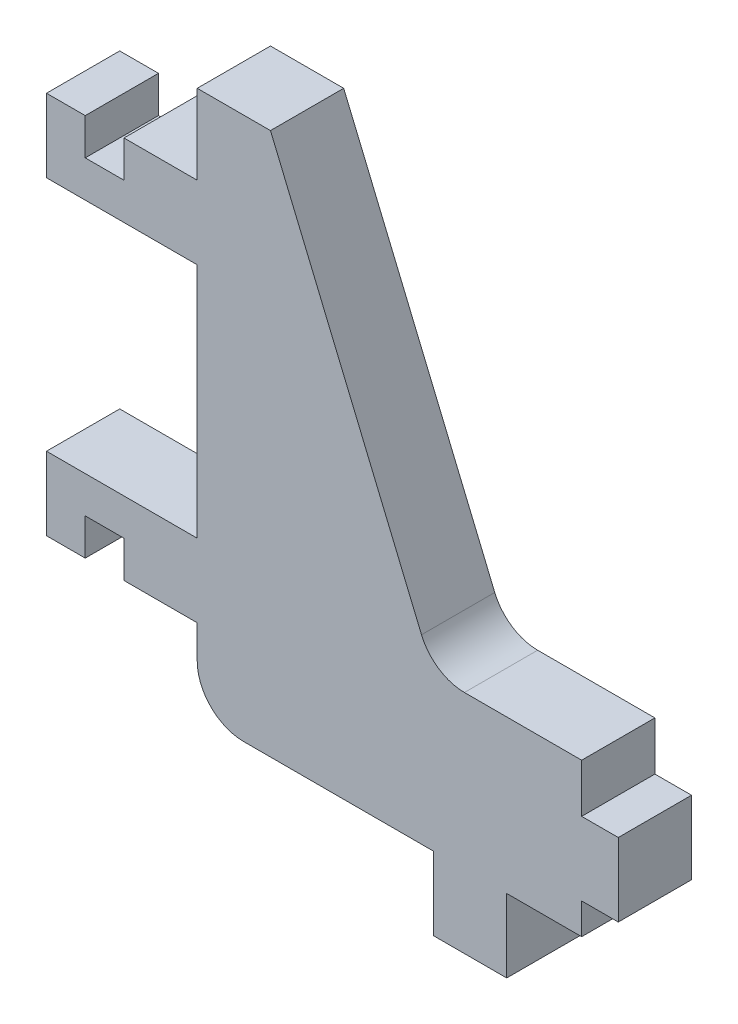
ISO-10303-21;
HEADER;
FILE_DESCRIPTION(('STEP AP214'),'2;1');
FILE_NAME('part.step','',(''),(''),'','','');
FILE_SCHEMA(('AUTOMOTIVE_DESIGN { 1 0 10303 214 1 1 1 1 }'));
ENDSEC;
DATA;
#1=APPLICATION_CONTEXT('core data for automotive mechanical design processes');
#2=APPLICATION_PROTOCOL_DEFINITION('international standard','automotive_design',2000,#1);
#3=PRODUCT_CONTEXT('',#1,'mechanical');
#4=PRODUCT('Part','Part','',(#3));
#5=PRODUCT_RELATED_PRODUCT_CATEGORY('part','',(#4));
#6=PRODUCT_DEFINITION_FORMATION('','',#4);
#7=PRODUCT_DEFINITION_CONTEXT('part definition',#1,'design');
#8=PRODUCT_DEFINITION('design','',#6,#7);
#9=PRODUCT_DEFINITION_SHAPE('','',#8);
#10=(LENGTH_UNIT() NAMED_UNIT(*) SI_UNIT(.MILLI.,.METRE.));
#11=(NAMED_UNIT(*) PLANE_ANGLE_UNIT() SI_UNIT($,.RADIAN.));
#12=(NAMED_UNIT(*) SI_UNIT($,.STERADIAN.) SOLID_ANGLE_UNIT());
#13=UNCERTAINTY_MEASURE_WITH_UNIT(LENGTH_MEASURE(1.E-05),#10,'distance_accuracy_value','');
#14=(GEOMETRIC_REPRESENTATION_CONTEXT(3) GLOBAL_UNCERTAINTY_ASSIGNED_CONTEXT((#13)) GLOBAL_UNIT_ASSIGNED_CONTEXT((#10,
#11,#12)) REPRESENTATION_CONTEXT('',''));
#15=CARTESIAN_POINT('',(0.,0.,0.));
#16=DIRECTION('',(0.,0.,1.));
#17=DIRECTION('',(1.,0.,0.));
#18=AXIS2_PLACEMENT_3D('',#15,#16,#17);
#19=CARTESIAN_POINT('',(-12.35,0.,6.));
#20=DIRECTION('',(1.,0.,0.));
#21=DIRECTION('',(0.,1.,0.));
#22=AXIS2_PLACEMENT_3D('',#19,#20,#21);
#23=PLANE('',#22);
#24=DIRECTION('',(0.,-1.,0.));
#25=VECTOR('',#24,1.);
#26=CARTESIAN_POINT('',(-12.35,0.,0.));
#27=LINE('',#26,#25);
#28=CARTESIAN_POINT('',(-12.35,37.925,0.));
#29=VERTEX_POINT('',#28);
#30=CARTESIAN_POINT('',(-12.35,31.925,0.));
#31=VERTEX_POINT('',#30);
#32=EDGE_CURVE('E283',#29,#31,#27,.T.);
#33=ORIENTED_EDGE('',*,*,#32,.T.);
#34=DIRECTION('',(0.,0.,-1.));
#35=VECTOR('',#34,1.);
#36=CARTESIAN_POINT('',(-12.35,31.925,6.));
#37=LINE('',#36,#35);
#38=CARTESIAN_POINT('',(-12.35,31.925,6.));
#39=VERTEX_POINT('',#38);
#40=EDGE_CURVE('E262',#39,#31,#37,.T.);
#41=ORIENTED_EDGE('',*,*,#40,.F.);
#42=DIRECTION('',(0.,-1.,0.));
#43=VECTOR('',#42,1.);
#44=CARTESIAN_POINT('',(-12.35,0.,6.));
#45=LINE('',#44,#43);
#46=CARTESIAN_POINT('',(-12.35,37.925,6.));
#47=VERTEX_POINT('',#46);
#48=EDGE_CURVE('E269',#47,#39,#45,.T.);
#49=ORIENTED_EDGE('',*,*,#48,.F.);
#50=DIRECTION('',(0.,0.,-1.));
#51=VECTOR('',#50,1.);
#52=CARTESIAN_POINT('',(-12.35,37.925,6.));
#53=LINE('',#52,#51);
#54=EDGE_CURVE('E361',#47,#29,#53,.T.);
#55=ORIENTED_EDGE('',*,*,#54,.T.);
#56=EDGE_LOOP('',(#33,#41,#49,#55));
#57=FACE_BOUND('',#56,.T.);
#58=ADVANCED_FACE('F47',(#57),#23,.F.);
#59=CARTESIAN_POINT('',(0.,31.925,6.));
#60=DIRECTION('',(0.,1.,0.));
#61=DIRECTION('',(0.,0.,1.));
#62=AXIS2_PLACEMENT_3D('',#59,#60,#61);
#63=PLANE('',#62);
#64=DIRECTION('',(1.,0.,0.));
#65=VECTOR('',#64,1.);
#66=CARTESIAN_POINT('',(0.,31.925,0.));
#67=LINE('',#66,#65);
#68=CARTESIAN_POINT('',(0.,31.925,0.));
#69=VERTEX_POINT('',#68);
#70=EDGE_CURVE('E364',#31,#69,#67,.T.);
#71=ORIENTED_EDGE('',*,*,#70,.T.);
#72=DIRECTION('',(0.,0.,-1.));
#73=VECTOR('',#72,1.);
#74=CARTESIAN_POINT('',(0.,31.925,6.));
#75=LINE('',#74,#73);
#76=CARTESIAN_POINT('',(0.,31.925,6.));
#77=VERTEX_POINT('',#76);
#78=EDGE_CURVE('E264',#77,#69,#75,.T.);
#79=ORIENTED_EDGE('',*,*,#78,.F.);
#80=DIRECTION('',(1.,0.,0.));
#81=VECTOR('',#80,1.);
#82=CARTESIAN_POINT('',(0.,31.925,6.));
#83=LINE('',#82,#81);
#84=EDGE_CURVE('E257',#39,#77,#83,.T.);
#85=ORIENTED_EDGE('',*,*,#84,.F.);
#86=ORIENTED_EDGE('',*,*,#40,.T.);
#87=EDGE_LOOP('',(#71,#79,#85,#86));
#88=FACE_BOUND('',#87,.T.);
#89=ADVANCED_FACE('F260',(#88),#63,.F.);
#90=CARTESIAN_POINT('',(0.,0.,6.));
#91=DIRECTION('',(-1.,0.,0.));
#92=DIRECTION('',(0.,0.,1.));
#93=AXIS2_PLACEMENT_3D('',#90,#91,#92);
#94=PLANE('',#93);
#95=DIRECTION('',(0.,1.,0.));
#96=VECTOR('',#95,1.);
#97=CARTESIAN_POINT('',(0.,0.,0.));
#98=LINE('',#97,#96);
#99=CARTESIAN_POINT('',(0.,12.525,0.));
#100=VERTEX_POINT('',#99);
#101=EDGE_CURVE('E367',#100,#69,#98,.T.);
#102=ORIENTED_EDGE('',*,*,#101,.F.);
#103=DIRECTION('',(0.,0.,-1.));
#104=VECTOR('',#103,1.);
#105=CARTESIAN_POINT('',(0.,12.525,6.));
#106=LINE('',#105,#104);
#107=CARTESIAN_POINT('',(0.,12.525,6.));
#108=VERTEX_POINT('',#107);
#109=EDGE_CURVE('E292',#108,#100,#106,.T.);
#110=ORIENTED_EDGE('',*,*,#109,.F.);
#111=DIRECTION('',(0.,1.,0.));
#112=VECTOR('',#111,1.);
#113=CARTESIAN_POINT('',(0.,0.,6.));
#114=LINE('',#113,#112);
#115=EDGE_CURVE('E268',#108,#77,#114,.T.);
#116=ORIENTED_EDGE('',*,*,#115,.T.);
#117=ORIENTED_EDGE('',*,*,#78,.T.);
#118=EDGE_LOOP('',(#102,#110,#116,#117));
#119=FACE_BOUND('',#118,.T.);
#120=ADVANCED_FACE('F543',(#119),#94,.T.);
#121=CARTESIAN_POINT('',(0.,12.525,6.));
#122=DIRECTION('',(0.,1.,0.));
#123=DIRECTION('',(0.,0.,1.));
#124=AXIS2_PLACEMENT_3D('',#121,#122,#123);
#125=PLANE('',#124);
#126=DIRECTION('',(1.,0.,0.));
#127=VECTOR('',#126,1.);
#128=CARTESIAN_POINT('',(0.,12.525,0.));
#129=LINE('',#128,#127);
#130=CARTESIAN_POINT('',(-12.35,12.525,0.));
#131=VERTEX_POINT('',#130);
#132=EDGE_CURVE('E371',#131,#100,#129,.T.);
#133=ORIENTED_EDGE('',*,*,#132,.F.);
#134=DIRECTION('',(0.,0.,-1.));
#135=VECTOR('',#134,1.);
#136=CARTESIAN_POINT('',(-12.35,12.525,6.));
#137=LINE('',#136,#135);
#138=CARTESIAN_POINT('',(-12.35,12.525,6.));
#139=VERTEX_POINT('',#138);
#140=EDGE_CURVE('E532',#139,#131,#137,.T.);
#141=ORIENTED_EDGE('',*,*,#140,.F.);
#142=DIRECTION('',(1.,0.,0.));
#143=VECTOR('',#142,1.);
#144=CARTESIAN_POINT('',(0.,12.525,6.));
#145=LINE('',#144,#143);
#146=EDGE_CURVE('E541',#139,#108,#145,.T.);
#147=ORIENTED_EDGE('',*,*,#146,.T.);
#148=ORIENTED_EDGE('',*,*,#109,.T.);
#149=EDGE_LOOP('',(#133,#141,#147,#148));
#150=FACE_BOUND('',#149,.T.);
#151=ADVANCED_FACE('F539',(#150),#125,.T.);
#152=CARTESIAN_POINT('',(-12.35,0.,6.));
#153=DIRECTION('',(-1.,0.,0.));
#154=DIRECTION('',(0.,-1.,0.));
#155=AXIS2_PLACEMENT_3D('',#152,#153,#154);
#156=PLANE('',#155);
#157=DIRECTION('',(0.,1.,0.));
#158=VECTOR('',#157,1.);
#159=CARTESIAN_POINT('',(-12.35,0.,0.));
#160=LINE('',#159,#158);
#161=CARTESIAN_POINT('',(-12.35,6.525,0.));
#162=VERTEX_POINT('',#161);
#163=EDGE_CURVE('E377',#162,#131,#160,.T.);
#164=ORIENTED_EDGE('',*,*,#163,.F.);
#165=DIRECTION('',(0.,0.,-1.));
#166=VECTOR('',#165,1.);
#167=CARTESIAN_POINT('',(-12.35,6.525,6.));
#168=LINE('',#167,#166);
#169=CARTESIAN_POINT('',(-12.35,6.525,6.));
#170=VERTEX_POINT('',#169);
#171=EDGE_CURVE('E529',#170,#162,#168,.T.);
#172=ORIENTED_EDGE('',*,*,#171,.F.);
#173=DIRECTION('',(0.,1.,0.));
#174=VECTOR('',#173,1.);
#175=CARTESIAN_POINT('',(-12.35,0.,6.));
#176=LINE('',#175,#174);
#177=EDGE_CURVE('E550',#170,#139,#176,.T.);
#178=ORIENTED_EDGE('',*,*,#177,.T.);
#179=ORIENTED_EDGE('',*,*,#140,.T.);
#180=EDGE_LOOP('',(#164,#172,#178,#179));
#181=FACE_BOUND('',#180,.T.);
#182=ADVANCED_FACE('F547',(#181),#156,.T.);
#183=CARTESIAN_POINT('',(0.,6.52499999999999,6.));
#184=DIRECTION('',(0.,-1.,0.));
#185=DIRECTION('',(1.,0.,0.));
#186=AXIS2_PLACEMENT_3D('',#183,#184,#185);
#187=PLANE('',#186);
#188=DIRECTION('',(-1.,0.,0.));
#189=VECTOR('',#188,1.);
#190=CARTESIAN_POINT('',(0.,6.52499999999999,0.));
#191=LINE('',#190,#189);
#192=CARTESIAN_POINT('',(-9.175,6.525,0.));
#193=VERTEX_POINT('',#192);
#194=EDGE_CURVE('E381',#193,#162,#191,.T.);
#195=ORIENTED_EDGE('',*,*,#194,.F.);
#196=DIRECTION('',(0.,0.,-1.));
#197=VECTOR('',#196,1.);
#198=CARTESIAN_POINT('',(-9.175,6.525,6.));
#199=LINE('',#198,#197);
#200=CARTESIAN_POINT('',(-9.175,6.525,6.));
#201=VERTEX_POINT('',#200);
#202=EDGE_CURVE('E526',#201,#193,#199,.T.);
#203=ORIENTED_EDGE('',*,*,#202,.F.);
#204=DIRECTION('',(-1.,0.,0.));
#205=VECTOR('',#204,1.);
#206=CARTESIAN_POINT('',(0.,6.52499999999999,6.));
#207=LINE('',#206,#205);
#208=EDGE_CURVE('E557',#201,#170,#207,.T.);
#209=ORIENTED_EDGE('',*,*,#208,.T.);
#210=ORIENTED_EDGE('',*,*,#171,.T.);
#211=EDGE_LOOP('',(#195,#203,#209,#210));
#212=FACE_BOUND('',#211,.T.);
#213=ADVANCED_FACE('F805',(#212),#187,.T.);
#214=CARTESIAN_POINT('',(-9.175,0.,6.));
#215=DIRECTION('',(1.,0.,0.));
#216=DIRECTION('',(0.,0.,-1.));
#217=AXIS2_PLACEMENT_3D('',#214,#215,#216);
#218=PLANE('',#217);
#219=DIRECTION('',(0.,-1.,0.));
#220=VECTOR('',#219,1.);
#221=CARTESIAN_POINT('',(-9.175,0.,0.));
#222=LINE('',#221,#220);
#223=CARTESIAN_POINT('',(-9.175,9.525,0.));
#224=VERTEX_POINT('',#223);
#225=EDGE_CURVE('E385',#224,#193,#222,.T.);
#226=ORIENTED_EDGE('',*,*,#225,.F.);
#227=DIRECTION('',(0.,0.,-1.));
#228=VECTOR('',#227,1.);
#229=CARTESIAN_POINT('',(-9.175,9.525,6.));
#230=LINE('',#229,#228);
#231=CARTESIAN_POINT('',(-9.175,9.525,6.));
#232=VERTEX_POINT('',#231);
#233=EDGE_CURVE('E523',#232,#224,#230,.T.);
#234=ORIENTED_EDGE('',*,*,#233,.F.);
#235=DIRECTION('',(0.,-1.,0.));
#236=VECTOR('',#235,1.);
#237=CARTESIAN_POINT('',(-9.175,0.,6.));
#238=LINE('',#237,#236);
#239=EDGE_CURVE('E564',#232,#201,#238,.T.);
#240=ORIENTED_EDGE('',*,*,#239,.T.);
#241=ORIENTED_EDGE('',*,*,#202,.T.);
#242=EDGE_LOOP('',(#226,#234,#240,#241));
#243=FACE_BOUND('',#242,.T.);
#244=ADVANCED_FACE('F795',(#243),#218,.T.);
#245=CARTESIAN_POINT('',(0.,9.525,6.));
#246=DIRECTION('',(0.,-1.,0.));
#247=DIRECTION('',(0.,0.,-1.));
#248=AXIS2_PLACEMENT_3D('',#245,#246,#247);
#249=PLANE('',#248);
#250=DIRECTION('',(-1.,0.,0.));
#251=VECTOR('',#250,1.);
#252=CARTESIAN_POINT('',(0.,9.525,0.));
#253=LINE('',#252,#251);
#254=CARTESIAN_POINT('',(-6.,9.525,0.));
#255=VERTEX_POINT('',#254);
#256=EDGE_CURVE('E389',#255,#224,#253,.T.);
#257=ORIENTED_EDGE('',*,*,#256,.F.);
#258=DIRECTION('',(0.,0.,-1.));
#259=VECTOR('',#258,1.);
#260=CARTESIAN_POINT('',(-6.,9.525,6.));
#261=LINE('',#260,#259);
#262=CARTESIAN_POINT('',(-6.,9.525,6.));
#263=VERTEX_POINT('',#262);
#264=EDGE_CURVE('E520',#263,#255,#261,.T.);
#265=ORIENTED_EDGE('',*,*,#264,.F.);
#266=DIRECTION('',(-1.,0.,0.));
#267=VECTOR('',#266,1.);
#268=CARTESIAN_POINT('',(0.,9.525,6.));
#269=LINE('',#268,#267);
#270=EDGE_CURVE('E568',#263,#232,#269,.T.);
#271=ORIENTED_EDGE('',*,*,#270,.T.);
#272=ORIENTED_EDGE('',*,*,#233,.T.);
#273=EDGE_LOOP('',(#257,#265,#271,#272));
#274=FACE_BOUND('',#273,.T.);
#275=ADVANCED_FACE('F785',(#274),#249,.T.);
#276=CARTESIAN_POINT('',(-6.,0.,6.));
#277=DIRECTION('',(-1.,0.,0.));
#278=DIRECTION('',(0.,0.,1.));
#279=AXIS2_PLACEMENT_3D('',#276,#277,#278);
#280=PLANE('',#279);
#281=DIRECTION('',(0.,1.,0.));
#282=VECTOR('',#281,1.);
#283=CARTESIAN_POINT('',(-6.,0.,0.));
#284=LINE('',#283,#282);
#285=CARTESIAN_POINT('',(-6.,6.525,0.));
#286=VERTEX_POINT('',#285);
#287=EDGE_CURVE('E393',#286,#255,#284,.T.);
#288=ORIENTED_EDGE('',*,*,#287,.F.);
#289=DIRECTION('',(0.,0.,-1.));
#290=VECTOR('',#289,1.);
#291=CARTESIAN_POINT('',(-6.,6.525,6.));
#292=LINE('',#291,#290);
#293=CARTESIAN_POINT('',(-6.,6.525,6.));
#294=VERTEX_POINT('',#293);
#295=EDGE_CURVE('E517',#294,#286,#292,.T.);
#296=ORIENTED_EDGE('',*,*,#295,.F.);
#297=DIRECTION('',(0.,1.,0.));
#298=VECTOR('',#297,1.);
#299=CARTESIAN_POINT('',(-6.,0.,6.));
#300=LINE('',#299,#298);
#301=EDGE_CURVE('E572',#294,#263,#300,.T.);
#302=ORIENTED_EDGE('',*,*,#301,.T.);
#303=ORIENTED_EDGE('',*,*,#264,.T.);
#304=EDGE_LOOP('',(#288,#296,#302,#303));
#305=FACE_BOUND('',#304,.T.);
#306=ADVANCED_FACE('F774',(#305),#280,.T.);
#307=CARTESIAN_POINT('',(0.,6.525,6.));
#308=DIRECTION('',(0.,-1.,0.));
#309=DIRECTION('',(1.,0.,0.));
#310=AXIS2_PLACEMENT_3D('',#307,#308,#309);
#311=PLANE('',#310);
#312=DIRECTION('',(-1.,0.,0.));
#313=VECTOR('',#312,1.);
#314=CARTESIAN_POINT('',(0.,6.525,0.));
#315=LINE('',#314,#313);
#316=CARTESIAN_POINT('',(0.,6.525,0.));
#317=VERTEX_POINT('',#316);
#318=EDGE_CURVE('E397',#317,#286,#315,.T.);
#319=ORIENTED_EDGE('',*,*,#318,.F.);
#320=DIRECTION('',(0.,0.,-1.));
#321=VECTOR('',#320,1.);
#322=CARTESIAN_POINT('',(0.,6.525,6.));
#323=LINE('',#322,#321);
#324=CARTESIAN_POINT('',(0.,6.525,6.));
#325=VERTEX_POINT('',#324);
#326=EDGE_CURVE('E513',#325,#317,#323,.T.);
#327=ORIENTED_EDGE('',*,*,#326,.F.);
#328=DIRECTION('',(-1.,0.,0.));
#329=VECTOR('',#328,1.);
#330=CARTESIAN_POINT('',(0.,6.525,6.));
#331=LINE('',#330,#329);
#332=EDGE_CURVE('E576',#325,#294,#331,.T.);
#333=ORIENTED_EDGE('',*,*,#332,.T.);
#334=ORIENTED_EDGE('',*,*,#295,.T.);
#335=EDGE_LOOP('',(#319,#327,#333,#334));
#336=FACE_BOUND('',#335,.T.);
#337=ADVANCED_FACE('F762',(#336),#311,.T.);
#338=CARTESIAN_POINT('',(0.,3.81,0.));
#339=VERTEX_POINT('',#338);
#340=EDGE_CURVE('E372',#339,#317,#98,.T.);
#341=ORIENTED_EDGE('',*,*,#340,.F.);
#342=DIRECTION('',(0.,0.,-1.));
#343=VECTOR('',#342,1.);
#344=CARTESIAN_POINT('',(0.,3.81,6.));
#345=LINE('',#344,#343);
#346=CARTESIAN_POINT('',(0.,3.81,6.));
#347=VERTEX_POINT('',#346);
#348=EDGE_CURVE('E298',#339,#347,#345,.F.);
#349=ORIENTED_EDGE('',*,*,#348,.T.);
#350=EDGE_CURVE('E560',#347,#325,#114,.T.);
#351=ORIENTED_EDGE('',*,*,#350,.T.);
#352=ORIENTED_EDGE('',*,*,#326,.T.);
#353=EDGE_LOOP('',(#341,#349,#351,#352));
#354=FACE_BOUND('',#353,.T.);
#355=ADVANCED_FACE('F660',(#354),#94,.T.);
#356=CARTESIAN_POINT('',(0.,0.,6.));
#357=DIRECTION('',(0.,1.,0.));
#358=DIRECTION('',(0.,0.,1.));
#359=AXIS2_PLACEMENT_3D('',#356,#357,#358);
#360=PLANE('',#359);
#361=DIRECTION('',(1.,0.,0.));
#362=VECTOR('',#361,1.);
#363=CARTESIAN_POINT('',(0.,0.,6.));
#364=LINE('',#363,#362);
#365=CARTESIAN_POINT('',(3.81,0.,6.));
#366=VERTEX_POINT('',#365);
#367=CARTESIAN_POINT('',(19.3548,0.,6.));
#368=VERTEX_POINT('',#367);
#369=EDGE_CURVE('E580',#366,#368,#364,.T.);
#370=ORIENTED_EDGE('',*,*,#369,.F.);
#371=DIRECTION('',(0.,0.,-1.));
#372=VECTOR('',#371,1.);
#373=CARTESIAN_POINT('',(3.81,0.,0.));
#374=LINE('',#373,#372);
#375=CARTESIAN_POINT('',(3.81,0.,0.));
#376=VERTEX_POINT('',#375);
#377=EDGE_CURVE('E285',#366,#376,#374,.T.);
#378=ORIENTED_EDGE('',*,*,#377,.T.);
#379=DIRECTION('',(1.,0.,0.));
#380=VECTOR('',#379,1.);
#381=CARTESIAN_POINT('',(0.,0.,0.));
#382=LINE('',#381,#380);
#383=CARTESIAN_POINT('',(19.3548,0.,0.));
#384=VERTEX_POINT('',#383);
#385=EDGE_CURVE('E401',#376,#384,#382,.T.);
#386=ORIENTED_EDGE('',*,*,#385,.T.);
#387=DIRECTION('',(0.,0.,-1.));
#388=VECTOR('',#387,1.);
#389=CARTESIAN_POINT('',(19.3548,0.,6.));
#390=LINE('',#389,#388);
#391=EDGE_CURVE('E509',#368,#384,#390,.T.);
#392=ORIENTED_EDGE('',*,*,#391,.F.);
#393=EDGE_LOOP('',(#370,#378,#386,#392));
#394=FACE_BOUND('',#393,.T.);
#395=ADVANCED_FACE('F654',(#394),#360,.F.);
#396=CARTESIAN_POINT('',(19.3548,0.,6.));
#397=DIRECTION('',(1.,0.,0.));
#398=DIRECTION('',(0.,0.,-1.));
#399=AXIS2_PLACEMENT_3D('',#396,#397,#398);
#400=PLANE('',#399);
#401=DIRECTION('',(0.,-1.,0.));
#402=VECTOR('',#401,1.);
#403=CARTESIAN_POINT('',(19.3548,0.,0.));
#404=LINE('',#403,#402);
#405=CARTESIAN_POINT('',(19.3548,-6.,0.));
#406=VERTEX_POINT('',#405);
#407=EDGE_CURVE('E404',#384,#406,#404,.T.);
#408=ORIENTED_EDGE('',*,*,#407,.T.);
#409=DIRECTION('',(0.,0.,-1.));
#410=VECTOR('',#409,1.);
#411=CARTESIAN_POINT('',(19.3548,-6.,6.));
#412=LINE('',#411,#410);
#413=CARTESIAN_POINT('',(19.3548,-6.,6.));
#414=VERTEX_POINT('',#413);
#415=EDGE_CURVE('E505',#414,#406,#412,.T.);
#416=ORIENTED_EDGE('',*,*,#415,.F.);
#417=DIRECTION('',(0.,-1.,0.));
#418=VECTOR('',#417,1.);
#419=CARTESIAN_POINT('',(19.3548,0.,6.));
#420=LINE('',#419,#418);
#421=EDGE_CURVE('E583',#368,#414,#420,.T.);
#422=ORIENTED_EDGE('',*,*,#421,.F.);
#423=ORIENTED_EDGE('',*,*,#391,.T.);
#424=EDGE_LOOP('',(#408,#416,#422,#423));
#425=FACE_BOUND('',#424,.T.);
#426=ADVANCED_FACE('F650',(#425),#400,.F.);
#427=CARTESIAN_POINT('',(0.,-6.,6.));
#428=DIRECTION('',(0.,1.,0.));
#429=DIRECTION('',(-1.,0.,0.));
#430=AXIS2_PLACEMENT_3D('',#427,#428,#429);
#431=PLANE('',#430);
#432=DIRECTION('',(1.,0.,0.));
#433=VECTOR('',#432,1.);
#434=CARTESIAN_POINT('',(0.,-6.,0.));
#435=LINE('',#434,#433);
#436=CARTESIAN_POINT('',(25.3548,-6.,0.));
#437=VERTEX_POINT('',#436);
#438=EDGE_CURVE('E407',#406,#437,#435,.T.);
#439=ORIENTED_EDGE('',*,*,#438,.T.);
#440=DIRECTION('',(0.,0.,-1.));
#441=VECTOR('',#440,1.);
#442=CARTESIAN_POINT('',(25.3548,-6.,6.));
#443=LINE('',#442,#441);
#444=CARTESIAN_POINT('',(25.3548,-6.,6.));
#445=VERTEX_POINT('',#444);
#446=EDGE_CURVE('E501',#445,#437,#443,.T.);
#447=ORIENTED_EDGE('',*,*,#446,.F.);
#448=DIRECTION('',(1.,0.,0.));
#449=VECTOR('',#448,1.);
#450=CARTESIAN_POINT('',(0.,-6.,6.));
#451=LINE('',#450,#449);
#452=EDGE_CURVE('E586',#414,#445,#451,.T.);
#453=ORIENTED_EDGE('',*,*,#452,.F.);
#454=ORIENTED_EDGE('',*,*,#415,.T.);
#455=EDGE_LOOP('',(#439,#447,#453,#454));
#456=FACE_BOUND('',#455,.T.);
#457=ADVANCED_FACE('F645',(#456),#431,.F.);
#458=CARTESIAN_POINT('',(25.3548,0.,6.));
#459=DIRECTION('',(-1.,0.,0.));
#460=DIRECTION('',(0.,0.,1.));
#461=AXIS2_PLACEMENT_3D('',#458,#459,#460);
#462=PLANE('',#461);
#463=DIRECTION('',(0.,1.,0.));
#464=VECTOR('',#463,1.);
#465=CARTESIAN_POINT('',(25.3548,0.,0.));
#466=LINE('',#465,#464);
#467=CARTESIAN_POINT('',(25.3548,0.,0.));
#468=VERTEX_POINT('',#467);
#469=EDGE_CURVE('E410',#437,#468,#466,.T.);
#470=ORIENTED_EDGE('',*,*,#469,.T.);
#471=DIRECTION('',(0.,0.,-1.));
#472=VECTOR('',#471,1.);
#473=CARTESIAN_POINT('',(25.3548,0.,6.));
#474=LINE('',#473,#472);
#475=CARTESIAN_POINT('',(25.3548,0.,6.));
#476=VERTEX_POINT('',#475);
#477=EDGE_CURVE('E497',#476,#468,#474,.T.);
#478=ORIENTED_EDGE('',*,*,#477,.F.);
#479=DIRECTION('',(0.,1.,0.));
#480=VECTOR('',#479,1.);
#481=CARTESIAN_POINT('',(25.3548,0.,6.));
#482=LINE('',#481,#480);
#483=EDGE_CURVE('E589',#445,#476,#482,.T.);
#484=ORIENTED_EDGE('',*,*,#483,.F.);
#485=ORIENTED_EDGE('',*,*,#446,.T.);
#486=EDGE_LOOP('',(#470,#478,#484,#485));
#487=FACE_BOUND('',#486,.T.);
#488=ADVANCED_FACE('F640',(#487),#462,.F.);
#489=CARTESIAN_POINT('',(0.,0.,6.));
#490=DIRECTION('',(0.,1.,0.));
#491=DIRECTION('',(0.,0.,1.));
#492=AXIS2_PLACEMENT_3D('',#489,#490,#491);
#493=PLANE('',#492);
#494=DIRECTION('',(1.,0.,0.));
#495=VECTOR('',#494,1.);
#496=CARTESIAN_POINT('',(0.,0.,0.));
#497=LINE('',#496,#495);
#498=CARTESIAN_POINT('',(31.496,0.,0.));
#499=VERTEX_POINT('',#498);
#500=EDGE_CURVE('E413',#468,#499,#497,.T.);
#501=ORIENTED_EDGE('',*,*,#500,.T.);
#502=DIRECTION('',(0.,0.,-1.));
#503=VECTOR('',#502,1.);
#504=CARTESIAN_POINT('',(31.496,0.,6.));
#505=LINE('',#504,#503);
#506=CARTESIAN_POINT('',(31.496,0.,6.));
#507=VERTEX_POINT('',#506);
#508=EDGE_CURVE('E493',#507,#499,#505,.T.);
#509=ORIENTED_EDGE('',*,*,#508,.F.);
#510=DIRECTION('',(1.,0.,0.));
#511=VECTOR('',#510,1.);
#512=CARTESIAN_POINT('',(0.,0.,6.));
#513=LINE('',#512,#511);
#514=EDGE_CURVE('E592',#476,#507,#513,.T.);
#515=ORIENTED_EDGE('',*,*,#514,.F.);
#516=ORIENTED_EDGE('',*,*,#477,.T.);
#517=EDGE_LOOP('',(#501,#509,#515,#516));
#518=FACE_BOUND('',#517,.T.);
#519=ADVANCED_FACE('F636',(#518),#493,.F.);
#520=CARTESIAN_POINT('',(31.496,0.,6.));
#521=DIRECTION('',(-1.,0.,0.));
#522=DIRECTION('',(0.,0.,1.));
#523=AXIS2_PLACEMENT_3D('',#520,#521,#522);
#524=PLANE('',#523);
#525=DIRECTION('',(0.,1.,0.));
#526=VECTOR('',#525,1.);
#527=CARTESIAN_POINT('',(31.496,0.,0.));
#528=LINE('',#527,#526);
#529=CARTESIAN_POINT('',(31.496,2.54,0.));
#530=VERTEX_POINT('',#529);
#531=EDGE_CURVE('E416',#499,#530,#528,.T.);
#532=ORIENTED_EDGE('',*,*,#531,.T.);
#533=DIRECTION('',(0.,0.,-1.));
#534=VECTOR('',#533,1.);
#535=CARTESIAN_POINT('',(31.496,2.54,6.));
#536=LINE('',#535,#534);
#537=CARTESIAN_POINT('',(31.496,2.54,6.));
#538=VERTEX_POINT('',#537);
#539=EDGE_CURVE('E489',#538,#530,#536,.T.);
#540=ORIENTED_EDGE('',*,*,#539,.F.);
#541=DIRECTION('',(0.,1.,0.));
#542=VECTOR('',#541,1.);
#543=CARTESIAN_POINT('',(31.496,0.,6.));
#544=LINE('',#543,#542);
#545=EDGE_CURVE('E595',#507,#538,#544,.T.);
#546=ORIENTED_EDGE('',*,*,#545,.F.);
#547=ORIENTED_EDGE('',*,*,#508,.T.);
#548=EDGE_LOOP('',(#532,#540,#546,#547));
#549=FACE_BOUND('',#548,.T.);
#550=ADVANCED_FACE('F631',(#549),#524,.F.);
#551=CARTESIAN_POINT('',(0.,2.54,6.));
#552=DIRECTION('',(0.,1.,0.));
#553=DIRECTION('',(0.,0.,1.));
#554=AXIS2_PLACEMENT_3D('',#551,#552,#553);
#555=PLANE('',#554);
#556=DIRECTION('',(1.,0.,0.));
#557=VECTOR('',#556,1.);
#558=CARTESIAN_POINT('',(0.,2.54,0.));
#559=LINE('',#558,#557);
#560=CARTESIAN_POINT('',(34.496,2.54,0.));
#561=VERTEX_POINT('',#560);
#562=EDGE_CURVE('E419',#530,#561,#559,.T.);
#563=ORIENTED_EDGE('',*,*,#562,.T.);
#564=DIRECTION('',(0.,0.,-1.));
#565=VECTOR('',#564,1.);
#566=CARTESIAN_POINT('',(34.496,2.54,6.));
#567=LINE('',#566,#565);
#568=CARTESIAN_POINT('',(34.496,2.54,6.));
#569=VERTEX_POINT('',#568);
#570=EDGE_CURVE('E485',#569,#561,#567,.T.);
#571=ORIENTED_EDGE('',*,*,#570,.F.);
#572=DIRECTION('',(1.,0.,0.));
#573=VECTOR('',#572,1.);
#574=CARTESIAN_POINT('',(0.,2.54,6.));
#575=LINE('',#574,#573);
#576=EDGE_CURVE('E598',#538,#569,#575,.T.);
#577=ORIENTED_EDGE('',*,*,#576,.F.);
#578=ORIENTED_EDGE('',*,*,#539,.T.);
#579=EDGE_LOOP('',(#563,#571,#577,#578));
#580=FACE_BOUND('',#579,.T.);
#581=ADVANCED_FACE('F625',(#580),#555,.F.);
#582=CARTESIAN_POINT('',(34.496,0.,6.));
#583=DIRECTION('',(-1.,0.,0.));
#584=DIRECTION('',(0.,0.,1.));
#585=AXIS2_PLACEMENT_3D('',#582,#583,#584);
#586=PLANE('',#585);
#587=DIRECTION('',(0.,1.,0.));
#588=VECTOR('',#587,1.);
#589=CARTESIAN_POINT('',(34.496,0.,0.));
#590=LINE('',#589,#588);
#591=CARTESIAN_POINT('',(34.496,8.54,0.));
#592=VERTEX_POINT('',#591);
#593=EDGE_CURVE('E422',#561,#592,#590,.T.);
#594=ORIENTED_EDGE('',*,*,#593,.T.);
#595=DIRECTION('',(0.,0.,-1.));
#596=VECTOR('',#595,1.);
#597=CARTESIAN_POINT('',(34.496,8.54,6.));
#598=LINE('',#597,#596);
#599=CARTESIAN_POINT('',(34.496,8.54,6.));
#600=VERTEX_POINT('',#599);
#601=EDGE_CURVE('E481',#600,#592,#598,.T.);
#602=ORIENTED_EDGE('',*,*,#601,.F.);
#603=DIRECTION('',(0.,1.,0.));
#604=VECTOR('',#603,1.);
#605=CARTESIAN_POINT('',(34.496,0.,6.));
#606=LINE('',#605,#604);
#607=EDGE_CURVE('E601',#569,#600,#606,.T.);
#608=ORIENTED_EDGE('',*,*,#607,.F.);
#609=ORIENTED_EDGE('',*,*,#570,.T.);
#610=EDGE_LOOP('',(#594,#602,#608,#609));
#611=FACE_BOUND('',#610,.T.);
#612=ADVANCED_FACE('F621',(#611),#586,.F.);
#613=CARTESIAN_POINT('',(0.,8.54,6.));
#614=DIRECTION('',(0.,-1.,0.));
#615=DIRECTION('',(0.,0.,-1.));
#616=AXIS2_PLACEMENT_3D('',#613,#614,#615);
#617=PLANE('',#616);
#618=DIRECTION('',(-1.,0.,0.));
#619=VECTOR('',#618,1.);
#620=CARTESIAN_POINT('',(0.,8.54,0.));
#621=LINE('',#620,#619);
#622=CARTESIAN_POINT('',(31.496,8.54,0.));
#623=VERTEX_POINT('',#622);
#624=EDGE_CURVE('E425',#592,#623,#621,.T.);
#625=ORIENTED_EDGE('',*,*,#624,.T.);
#626=DIRECTION('',(0.,0.,-1.));
#627=VECTOR('',#626,1.);
#628=CARTESIAN_POINT('',(31.496,8.54,6.));
#629=LINE('',#628,#627);
#630=CARTESIAN_POINT('',(31.496,8.54,6.));
#631=VERTEX_POINT('',#630);
#632=EDGE_CURVE('E477',#631,#623,#629,.T.);
#633=ORIENTED_EDGE('',*,*,#632,.F.);
#634=DIRECTION('',(-1.,0.,0.));
#635=VECTOR('',#634,1.);
#636=CARTESIAN_POINT('',(0.,8.54,6.));
#637=LINE('',#636,#635);
#638=EDGE_CURVE('E604',#600,#631,#637,.T.);
#639=ORIENTED_EDGE('',*,*,#638,.F.);
#640=ORIENTED_EDGE('',*,*,#601,.T.);
#641=EDGE_LOOP('',(#625,#633,#639,#640));
#642=FACE_BOUND('',#641,.T.);
#643=ADVANCED_FACE('F617',(#642),#617,.F.);
#644=CARTESIAN_POINT('',(31.496,0.,6.));
#645=DIRECTION('',(-1.,0.,0.));
#646=DIRECTION('',(0.,0.,1.));
#647=AXIS2_PLACEMENT_3D('',#644,#645,#646);
#648=PLANE('',#647);
#649=DIRECTION('',(0.,1.,0.));
#650=VECTOR('',#649,1.);
#651=CARTESIAN_POINT('',(31.496,0.,0.));
#652=LINE('',#651,#650);
#653=CARTESIAN_POINT('',(31.496,12.525,0.));
#654=VERTEX_POINT('',#653);
#655=EDGE_CURVE('E327',#623,#654,#652,.T.);
#656=ORIENTED_EDGE('',*,*,#655,.T.);
#657=DIRECTION('',(0.,0.,-1.));
#658=VECTOR('',#657,1.);
#659=CARTESIAN_POINT('',(31.496,12.525,6.));
#660=LINE('',#659,#658);
#661=CARTESIAN_POINT('',(31.496,12.525,6.));
#662=VERTEX_POINT('',#661);
#663=EDGE_CURVE('E324',#662,#654,#660,.T.);
#664=ORIENTED_EDGE('',*,*,#663,.F.);
#665=DIRECTION('',(0.,1.,0.));
#666=VECTOR('',#665,1.);
#667=CARTESIAN_POINT('',(31.496,0.,6.));
#668=LINE('',#667,#666);
#669=EDGE_CURVE('E343',#631,#662,#668,.T.);
#670=ORIENTED_EDGE('',*,*,#669,.F.);
#671=ORIENTED_EDGE('',*,*,#632,.T.);
#672=EDGE_LOOP('',(#656,#664,#670,#671));
#673=FACE_BOUND('',#672,.T.);
#674=ADVANCED_FACE('F612',(#673),#648,.F.);
#675=CARTESIAN_POINT('',(0.,12.525,6.));
#676=DIRECTION('',(0.,1.,0.));
#677=DIRECTION('',(0.,0.,1.));
#678=AXIS2_PLACEMENT_3D('',#675,#676,#677);
#679=PLANE('',#678);
#680=DIRECTION('',(1.,0.,0.));
#681=VECTOR('',#680,1.);
#682=CARTESIAN_POINT('',(0.,12.525,0.));
#683=LINE('',#682,#681);
#684=CARTESIAN_POINT('',(21.8909324994414,12.525,0.));
#685=VERTEX_POINT('',#684);
#686=EDGE_CURVE('E315',#685,#654,#683,.T.);
#687=ORIENTED_EDGE('',*,*,#686,.F.);
#688=DIRECTION('',(0.,0.,-1.));
#689=VECTOR('',#688,1.);
#690=CARTESIAN_POINT('',(21.8909324994414,12.525,6.));
#691=LINE('',#690,#689);
#692=CARTESIAN_POINT('',(21.8909324994414,12.525,6.));
#693=VERTEX_POINT('',#692);
#694=EDGE_CURVE('E69',#685,#693,#691,.F.);
#695=ORIENTED_EDGE('',*,*,#694,.T.);
#696=DIRECTION('',(1.,0.,0.));
#697=VECTOR('',#696,1.);
#698=CARTESIAN_POINT('',(0.,12.525,6.));
#699=LINE('',#698,#697);
#700=EDGE_CURVE('E337',#693,#662,#699,.T.);
#701=ORIENTED_EDGE('',*,*,#700,.T.);
#702=ORIENTED_EDGE('',*,*,#663,.T.);
#703=EDGE_LOOP('',(#687,#695,#701,#702));
#704=FACE_BOUND('',#703,.T.);
#705=ADVANCED_FACE('F322',(#704),#679,.T.);
#706=CARTESIAN_POINT('',(20.9314414171686,8.75599730111209,6.));
#707=DIRECTION('',(0.922535175809991,0.385913007546038,0.));
#708=DIRECTION('',(-0.385913007546038,0.922535175809991,0.));
#709=AXIS2_PLACEMENT_3D('',#706,#707,#708);
#710=PLANE('',#709);
#711=DIRECTION('',(0.385913007546038,-0.922535175809991,0.));
#712=VECTOR('',#711,1.);
#713=CARTESIAN_POINT('',(20.9314414171686,8.75599730111209,6.));
#714=LINE('',#713,#712);
#715=CARTESIAN_POINT('',(6.,44.45,6.));
#716=VERTEX_POINT('',#715);
#717=CARTESIAN_POINT('',(18.3760734796053,14.8646714412496,6.));
#718=VERTEX_POINT('',#717);
#719=EDGE_CURVE('E331',#716,#718,#714,.T.);
#720=ORIENTED_EDGE('',*,*,#719,.T.);
#721=DIRECTION('',(0.,0.,-1.));
#722=VECTOR('',#721,1.);
#723=CARTESIAN_POINT('',(18.3760734796053,14.8646714412496,0.));
#724=LINE('',#723,#722);
#725=CARTESIAN_POINT('',(18.3760734796053,14.8646714412496,0.));
#726=VERTEX_POINT('',#725);
#727=EDGE_CURVE('E304',#718,#726,#724,.T.);
#728=ORIENTED_EDGE('',*,*,#727,.T.);
#729=DIRECTION('',(0.385913007546038,-0.922535175809991,0.));
#730=VECTOR('',#729,1.);
#731=CARTESIAN_POINT('',(20.9314414171686,8.75599730111209,0.));
#732=LINE('',#731,#730);
#733=CARTESIAN_POINT('',(6.,44.45,0.));
#734=VERTEX_POINT('',#733);
#735=EDGE_CURVE('E319',#734,#726,#732,.T.);
#736=ORIENTED_EDGE('',*,*,#735,.F.);
#737=DIRECTION('',(0.,0.,-1.));
#738=VECTOR('',#737,1.);
#739=CARTESIAN_POINT('',(6.,44.45,6.));
#740=LINE('',#739,#738);
#741=EDGE_CURVE('E332',#716,#734,#740,.T.);
#742=ORIENTED_EDGE('',*,*,#741,.F.);
#743=EDGE_LOOP('',(#720,#728,#736,#742));
#744=FACE_BOUND('',#743,.T.);
#745=ADVANCED_FACE('F330',(#744),#710,.T.);
#746=CARTESIAN_POINT('',(0.,44.45,6.));
#747=DIRECTION('',(0.,1.,0.));
#748=DIRECTION('',(0.,0.,1.));
#749=AXIS2_PLACEMENT_3D('',#746,#747,#748);
#750=PLANE('',#749);
#751=DIRECTION('',(1.,0.,0.));
#752=VECTOR('',#751,1.);
#753=CARTESIAN_POINT('',(0.,44.45,0.));
#754=LINE('',#753,#752);
#755=CARTESIAN_POINT('',(0.,44.45,0.));
#756=VERTEX_POINT('',#755);
#757=EDGE_CURVE('E432',#756,#734,#754,.T.);
#758=ORIENTED_EDGE('',*,*,#757,.F.);
#759=DIRECTION('',(0.,0.,-1.));
#760=VECTOR('',#759,1.);
#761=CARTESIAN_POINT('',(0.,44.45,6.));
#762=LINE('',#761,#760);
#763=CARTESIAN_POINT('',(0.,44.45,6.));
#764=VERTEX_POINT('',#763);
#765=EDGE_CURVE('E470',#764,#756,#762,.T.);
#766=ORIENTED_EDGE('',*,*,#765,.F.);
#767=DIRECTION('',(1.,0.,0.));
#768=VECTOR('',#767,1.);
#769=CARTESIAN_POINT('',(0.,44.45,6.));
#770=LINE('',#769,#768);
#771=EDGE_CURVE('E336',#764,#716,#770,.T.);
#772=ORIENTED_EDGE('',*,*,#771,.T.);
#773=ORIENTED_EDGE('',*,*,#741,.T.);
#774=EDGE_LOOP('',(#758,#766,#772,#773));
#775=FACE_BOUND('',#774,.T.);
#776=ADVANCED_FACE('F679',(#775),#750,.T.);
#777=CARTESIAN_POINT('',(0.,37.925,0.));
#778=VERTEX_POINT('',#777);
#779=EDGE_CURVE('E373',#778,#756,#98,.T.);
#780=ORIENTED_EDGE('',*,*,#779,.F.);
#781=DIRECTION('',(0.,0.,-1.));
#782=VECTOR('',#781,1.);
#783=CARTESIAN_POINT('',(0.,37.925,6.));
#784=LINE('',#783,#782);
#785=CARTESIAN_POINT('',(0.,37.925,6.));
#786=VERTEX_POINT('',#785);
#787=EDGE_CURVE('E467',#786,#778,#784,.T.);
#788=ORIENTED_EDGE('',*,*,#787,.F.);
#789=EDGE_CURVE('E341',#786,#764,#114,.T.);
#790=ORIENTED_EDGE('',*,*,#789,.T.);
#791=ORIENTED_EDGE('',*,*,#765,.T.);
#792=EDGE_LOOP('',(#780,#788,#790,#791));
#793=FACE_BOUND('',#792,.T.);
#794=ADVANCED_FACE('F674',(#793),#94,.T.);
#795=CARTESIAN_POINT('',(0.,37.925,6.));
#796=DIRECTION('',(0.,-1.,0.));
#797=DIRECTION('',(1.,0.,0.));
#798=AXIS2_PLACEMENT_3D('',#795,#796,#797);
#799=PLANE('',#798);
#800=DIRECTION('',(-1.,0.,0.));
#801=VECTOR('',#800,1.);
#802=CARTESIAN_POINT('',(0.,37.925,0.));
#803=LINE('',#802,#801);
#804=CARTESIAN_POINT('',(-6.,37.925,0.));
#805=VERTEX_POINT('',#804);
#806=EDGE_CURVE('E435',#778,#805,#803,.T.);
#807=ORIENTED_EDGE('',*,*,#806,.T.);
#808=DIRECTION('',(0.,0.,-1.));
#809=VECTOR('',#808,1.);
#810=CARTESIAN_POINT('',(-6.,37.925,6.));
#811=LINE('',#810,#809);
#812=CARTESIAN_POINT('',(-6.,37.925,6.));
#813=VERTEX_POINT('',#812);
#814=EDGE_CURVE('E463',#813,#805,#811,.T.);
#815=ORIENTED_EDGE('',*,*,#814,.F.);
#816=DIRECTION('',(-1.,0.,0.));
#817=VECTOR('',#816,1.);
#818=CARTESIAN_POINT('',(0.,37.925,6.));
#819=LINE('',#818,#817);
#820=EDGE_CURVE('E347',#786,#813,#819,.T.);
#821=ORIENTED_EDGE('',*,*,#820,.F.);
#822=ORIENTED_EDGE('',*,*,#787,.T.);
#823=EDGE_LOOP('',(#807,#815,#821,#822));
#824=FACE_BOUND('',#823,.T.);
#825=ADVANCED_FACE('F686',(#824),#799,.F.);
#826=CARTESIAN_POINT('',(-6.,0.,6.));
#827=DIRECTION('',(1.,0.,0.));
#828=DIRECTION('',(0.,0.,-1.));
#829=AXIS2_PLACEMENT_3D('',#826,#827,#828);
#830=PLANE('',#829);
#831=DIRECTION('',(0.,-1.,0.));
#832=VECTOR('',#831,1.);
#833=CARTESIAN_POINT('',(-6.,0.,0.));
#834=LINE('',#833,#832);
#835=CARTESIAN_POINT('',(-6.,34.925,0.));
#836=VERTEX_POINT('',#835);
#837=EDGE_CURVE('E438',#805,#836,#834,.T.);
#838=ORIENTED_EDGE('',*,*,#837,.T.);
#839=DIRECTION('',(0.,0.,-1.));
#840=VECTOR('',#839,1.);
#841=CARTESIAN_POINT('',(-6.,34.925,6.));
#842=LINE('',#841,#840);
#843=CARTESIAN_POINT('',(-6.,34.925,6.));
#844=VERTEX_POINT('',#843);
#845=EDGE_CURVE('E459',#844,#836,#842,.T.);
#846=ORIENTED_EDGE('',*,*,#845,.F.);
#847=DIRECTION('',(0.,-1.,0.));
#848=VECTOR('',#847,1.);
#849=CARTESIAN_POINT('',(-6.,0.,6.));
#850=LINE('',#849,#848);
#851=EDGE_CURVE('E350',#813,#844,#850,.T.);
#852=ORIENTED_EDGE('',*,*,#851,.F.);
#853=ORIENTED_EDGE('',*,*,#814,.T.);
#854=EDGE_LOOP('',(#838,#846,#852,#853));
#855=FACE_BOUND('',#854,.T.);
#856=ADVANCED_FACE('F689',(#855),#830,.F.);
#857=CARTESIAN_POINT('',(0.,34.925,6.));
#858=DIRECTION('',(0.,-1.,0.));
#859=DIRECTION('',(0.,0.,-1.));
#860=AXIS2_PLACEMENT_3D('',#857,#858,#859);
#861=PLANE('',#860);
#862=DIRECTION('',(-1.,0.,0.));
#863=VECTOR('',#862,1.);
#864=CARTESIAN_POINT('',(0.,34.925,0.));
#865=LINE('',#864,#863);
#866=CARTESIAN_POINT('',(-9.175,34.925,0.));
#867=VERTEX_POINT('',#866);
#868=EDGE_CURVE('E441',#836,#867,#865,.T.);
#869=ORIENTED_EDGE('',*,*,#868,.T.);
#870=DIRECTION('',(0.,0.,-1.));
#871=VECTOR('',#870,1.);
#872=CARTESIAN_POINT('',(-9.175,34.925,6.));
#873=LINE('',#872,#871);
#874=CARTESIAN_POINT('',(-9.175,34.925,6.));
#875=VERTEX_POINT('',#874);
#876=EDGE_CURVE('E455',#875,#867,#873,.T.);
#877=ORIENTED_EDGE('',*,*,#876,.F.);
#878=DIRECTION('',(-1.,0.,0.));
#879=VECTOR('',#878,1.);
#880=CARTESIAN_POINT('',(0.,34.925,6.));
#881=LINE('',#880,#879);
#882=EDGE_CURVE('E353',#844,#875,#881,.T.);
#883=ORIENTED_EDGE('',*,*,#882,.F.);
#884=ORIENTED_EDGE('',*,*,#845,.T.);
#885=EDGE_LOOP('',(#869,#877,#883,#884));
#886=FACE_BOUND('',#885,.T.);
#887=ADVANCED_FACE('F696',(#886),#861,.F.);
#888=CARTESIAN_POINT('',(-9.175,0.,6.));
#889=DIRECTION('',(-1.,0.,0.));
#890=DIRECTION('',(0.,0.,1.));
#891=AXIS2_PLACEMENT_3D('',#888,#889,#890);
#892=PLANE('',#891);
#893=DIRECTION('',(0.,1.,0.));
#894=VECTOR('',#893,1.);
#895=CARTESIAN_POINT('',(-9.175,0.,0.));
#896=LINE('',#895,#894);
#897=CARTESIAN_POINT('',(-9.175,37.925,0.));
#898=VERTEX_POINT('',#897);
#899=EDGE_CURVE('E444',#867,#898,#896,.T.);
#900=ORIENTED_EDGE('',*,*,#899,.T.);
#901=DIRECTION('',(0.,0.,-1.));
#902=VECTOR('',#901,1.);
#903=CARTESIAN_POINT('',(-9.175,37.925,6.));
#904=LINE('',#903,#902);
#905=CARTESIAN_POINT('',(-9.175,37.925,6.));
#906=VERTEX_POINT('',#905);
#907=EDGE_CURVE('E451',#906,#898,#904,.T.);
#908=ORIENTED_EDGE('',*,*,#907,.F.);
#909=DIRECTION('',(0.,1.,0.));
#910=VECTOR('',#909,1.);
#911=CARTESIAN_POINT('',(-9.175,0.,6.));
#912=LINE('',#911,#910);
#913=EDGE_CURVE('E356',#875,#906,#912,.T.);
#914=ORIENTED_EDGE('',*,*,#913,.F.);
#915=ORIENTED_EDGE('',*,*,#876,.T.);
#916=EDGE_LOOP('',(#900,#908,#914,#915));
#917=FACE_BOUND('',#916,.T.);
#918=ADVANCED_FACE('F699',(#917),#892,.F.);
#919=CARTESIAN_POINT('',(0.,37.925,6.));
#920=DIRECTION('',(0.,-1.,0.));
#921=DIRECTION('',(1.,0.,0.));
#922=AXIS2_PLACEMENT_3D('',#919,#920,#921);
#923=PLANE('',#922);
#924=DIRECTION('',(-1.,0.,0.));
#925=VECTOR('',#924,1.);
#926=CARTESIAN_POINT('',(0.,37.925,0.));
#927=LINE('',#926,#925);
#928=EDGE_CURVE('E280',#898,#29,#927,.T.);
#929=ORIENTED_EDGE('',*,*,#928,.T.);
#930=ORIENTED_EDGE('',*,*,#54,.F.);
#931=DIRECTION('',(-1.,0.,0.));
#932=VECTOR('',#931,1.);
#933=CARTESIAN_POINT('',(0.,37.925,6.));
#934=LINE('',#933,#932);
#935=EDGE_CURVE('E275',#906,#47,#934,.T.);
#936=ORIENTED_EDGE('',*,*,#935,.F.);
#937=ORIENTED_EDGE('',*,*,#907,.T.);
#938=EDGE_LOOP('',(#929,#930,#936,#937));
#939=FACE_BOUND('',#938,.T.);
#940=ADVANCED_FACE('F702',(#939),#923,.F.);
#941=CARTESIAN_POINT('',(0.,0.,6.));
#942=DIRECTION('',(0.,0.,1.));
#943=DIRECTION('',(1.,0.,0.));
#944=AXIS2_PLACEMENT_3D('',#941,#942,#943);
#945=PLANE('',#944);
#946=ORIENTED_EDGE('',*,*,#350,.F.);
#947=CARTESIAN_POINT('',(3.81,3.81,6.));
#948=DIRECTION('',(0.,0.,1.));
#949=DIRECTION('',(1.,0.,0.));
#950=AXIS2_PLACEMENT_3D('',#947,#948,#949);
#951=CIRCLE('',#950,3.81);
#952=EDGE_CURVE('E301',#347,#366,#951,.T.);
#953=ORIENTED_EDGE('',*,*,#952,.T.);
#954=ORIENTED_EDGE('',*,*,#369,.T.);
#955=ORIENTED_EDGE('',*,*,#421,.T.);
#956=ORIENTED_EDGE('',*,*,#452,.T.);
#957=ORIENTED_EDGE('',*,*,#483,.T.);
#958=ORIENTED_EDGE('',*,*,#514,.T.);
#959=ORIENTED_EDGE('',*,*,#545,.T.);
#960=ORIENTED_EDGE('',*,*,#576,.T.);
#961=ORIENTED_EDGE('',*,*,#607,.T.);
#962=ORIENTED_EDGE('',*,*,#638,.T.);
#963=ORIENTED_EDGE('',*,*,#669,.T.);
#964=ORIENTED_EDGE('',*,*,#700,.F.);
#965=CARTESIAN_POINT('',(21.8909324994414,16.335,6.));
#966=DIRECTION('',(0.,0.,1.));
#967=DIRECTION('',(1.,0.,0.));
#968=AXIS2_PLACEMENT_3D('',#965,#966,#967);
#969=CIRCLE('',#968,3.81);
#970=EDGE_CURVE('E11',#693,#718,#969,.F.);
#971=ORIENTED_EDGE('',*,*,#970,.T.);
#972=ORIENTED_EDGE('',*,*,#719,.F.);
#973=ORIENTED_EDGE('',*,*,#771,.F.);
#974=ORIENTED_EDGE('',*,*,#789,.F.);
#975=ORIENTED_EDGE('',*,*,#820,.T.);
#976=ORIENTED_EDGE('',*,*,#851,.T.);
#977=ORIENTED_EDGE('',*,*,#882,.T.);
#978=ORIENTED_EDGE('',*,*,#913,.T.);
#979=ORIENTED_EDGE('',*,*,#935,.T.);
#980=ORIENTED_EDGE('',*,*,#48,.T.);
#981=ORIENTED_EDGE('',*,*,#84,.T.);
#982=ORIENTED_EDGE('',*,*,#115,.F.);
#983=ORIENTED_EDGE('',*,*,#146,.F.);
#984=ORIENTED_EDGE('',*,*,#177,.F.);
#985=ORIENTED_EDGE('',*,*,#208,.F.);
#986=ORIENTED_EDGE('',*,*,#239,.F.);
#987=ORIENTED_EDGE('',*,*,#270,.F.);
#988=ORIENTED_EDGE('',*,*,#301,.F.);
#989=ORIENTED_EDGE('',*,*,#332,.F.);
#990=EDGE_LOOP('',(#946,#953,#954,#955,#956,#957,#958,#959,#960,#961,#962,#963,#964,#971,#972,
#973,#974,#975,#976,#977,#978,#979,#980,#981,#982,#983,#984,#985,#986,#987,#988,#989));
#991=FACE_BOUND('',#990,.T.);
#992=ADVANCED_FACE('F273',(#991),#945,.T.);
#993=CARTESIAN_POINT('',(0.,0.,0.));
#994=DIRECTION('',(0.,0.,1.));
#995=DIRECTION('',(1.,0.,0.));
#996=AXIS2_PLACEMENT_3D('',#993,#994,#995);
#997=PLANE('',#996);
#998=ORIENTED_EDGE('',*,*,#385,.F.);
#999=CARTESIAN_POINT('',(3.81,3.81,0.));
#1000=DIRECTION('',(0.,0.,1.));
#1001=DIRECTION('',(1.,0.,0.));
#1002=AXIS2_PLACEMENT_3D('',#999,#1000,#1001);
#1003=CIRCLE('',#1002,3.81);
#1004=EDGE_CURVE('E290',#376,#339,#1003,.F.);
#1005=ORIENTED_EDGE('',*,*,#1004,.T.);
#1006=ORIENTED_EDGE('',*,*,#340,.T.);
#1007=ORIENTED_EDGE('',*,*,#318,.T.);
#1008=ORIENTED_EDGE('',*,*,#287,.T.);
#1009=ORIENTED_EDGE('',*,*,#256,.T.);
#1010=ORIENTED_EDGE('',*,*,#225,.T.);
#1011=ORIENTED_EDGE('',*,*,#194,.T.);
#1012=ORIENTED_EDGE('',*,*,#163,.T.);
#1013=ORIENTED_EDGE('',*,*,#132,.T.);
#1014=ORIENTED_EDGE('',*,*,#101,.T.);
#1015=ORIENTED_EDGE('',*,*,#70,.F.);
#1016=ORIENTED_EDGE('',*,*,#32,.F.);
#1017=ORIENTED_EDGE('',*,*,#928,.F.);
#1018=ORIENTED_EDGE('',*,*,#899,.F.);
#1019=ORIENTED_EDGE('',*,*,#868,.F.);
#1020=ORIENTED_EDGE('',*,*,#837,.F.);
#1021=ORIENTED_EDGE('',*,*,#806,.F.);
#1022=ORIENTED_EDGE('',*,*,#779,.T.);
#1023=ORIENTED_EDGE('',*,*,#757,.T.);
#1024=ORIENTED_EDGE('',*,*,#735,.T.);
#1025=CARTESIAN_POINT('',(21.8909324994414,16.335,0.));
#1026=DIRECTION('',(0.,0.,1.));
#1027=DIRECTION('',(1.,0.,0.));
#1028=AXIS2_PLACEMENT_3D('',#1025,#1026,#1027);
#1029=CIRCLE('',#1028,3.81);
#1030=EDGE_CURVE('E56',#726,#685,#1029,.T.);
#1031=ORIENTED_EDGE('',*,*,#1030,.T.);
#1032=ORIENTED_EDGE('',*,*,#686,.T.);
#1033=ORIENTED_EDGE('',*,*,#655,.F.);
#1034=ORIENTED_EDGE('',*,*,#624,.F.);
#1035=ORIENTED_EDGE('',*,*,#593,.F.);
#1036=ORIENTED_EDGE('',*,*,#562,.F.);
#1037=ORIENTED_EDGE('',*,*,#531,.F.);
#1038=ORIENTED_EDGE('',*,*,#500,.F.);
#1039=ORIENTED_EDGE('',*,*,#469,.F.);
#1040=ORIENTED_EDGE('',*,*,#438,.F.);
#1041=ORIENTED_EDGE('',*,*,#407,.F.);
#1042=EDGE_LOOP('',(#998,#1005,#1006,#1007,#1008,#1009,#1010,#1011,#1012,#1013,#1014,#1015,
#1016,#1017,#1018,#1019,#1020,#1021,#1022,#1023,#1024,#1031,#1032,#1033,#1034,#1035,#1036,#1037,
#1038,#1039,#1040,#1041));
#1043=FACE_BOUND('',#1042,.T.);
#1044=ADVANCED_FACE('F313',(#1043),#997,.F.);
#1045=CARTESIAN_POINT('',(3.81,3.81,6.));
#1046=DIRECTION('',(0.,0.,1.));
#1047=DIRECTION('',(1.,0.,0.));
#1048=AXIS2_PLACEMENT_3D('',#1045,#1046,#1047);
#1049=CYLINDRICAL_SURFACE('',#1048,3.81);
#1050=ORIENTED_EDGE('',*,*,#952,.F.);
#1051=ORIENTED_EDGE('',*,*,#348,.F.);
#1052=ORIENTED_EDGE('',*,*,#1004,.F.);
#1053=ORIENTED_EDGE('',*,*,#377,.F.);
#1054=EDGE_LOOP('',(#1050,#1051,#1052,#1053));
#1055=FACE_BOUND('',#1054,.T.);
#1056=ADVANCED_FACE('F665',(#1055),#1049,.T.);
#1057=CARTESIAN_POINT('',(21.8909324994414,16.335,6.));
#1058=DIRECTION('',(0.,0.,1.));
#1059=DIRECTION('',(1.,0.,0.));
#1060=AXIS2_PLACEMENT_3D('',#1057,#1058,#1059);
#1061=CYLINDRICAL_SURFACE('',#1060,3.81);
#1062=ORIENTED_EDGE('',*,*,#970,.F.);
#1063=ORIENTED_EDGE('',*,*,#694,.F.);
#1064=ORIENTED_EDGE('',*,*,#1030,.F.);
#1065=ORIENTED_EDGE('',*,*,#727,.F.);
#1066=EDGE_LOOP('',(#1062,#1063,#1064,#1065));
#1067=FACE_BOUND('',#1066,.T.);
#1068=ADVANCED_FACE('F49',(#1067),#1061,.F.);
#1069=CLOSED_SHELL('',(#58,#89,#120,#151,#182,#213,#244,#275,#306,#337,#355,#395,#426,#457,#488,
#519,#550,#581,#612,#643,#674,#705,#745,#776,#794,#825,#856,#887,#918,#940,#992,#1044,#1056,#1068));
#1070=MANIFOLD_SOLID_BREP('B2',#1069);
#1071=ADVANCED_BREP_SHAPE_REPRESENTATION('',(#18,#1070),#14);
#1072=SHAPE_DEFINITION_REPRESENTATION(#9,#1071);
ENDSEC;
END-ISO-10303-21;
